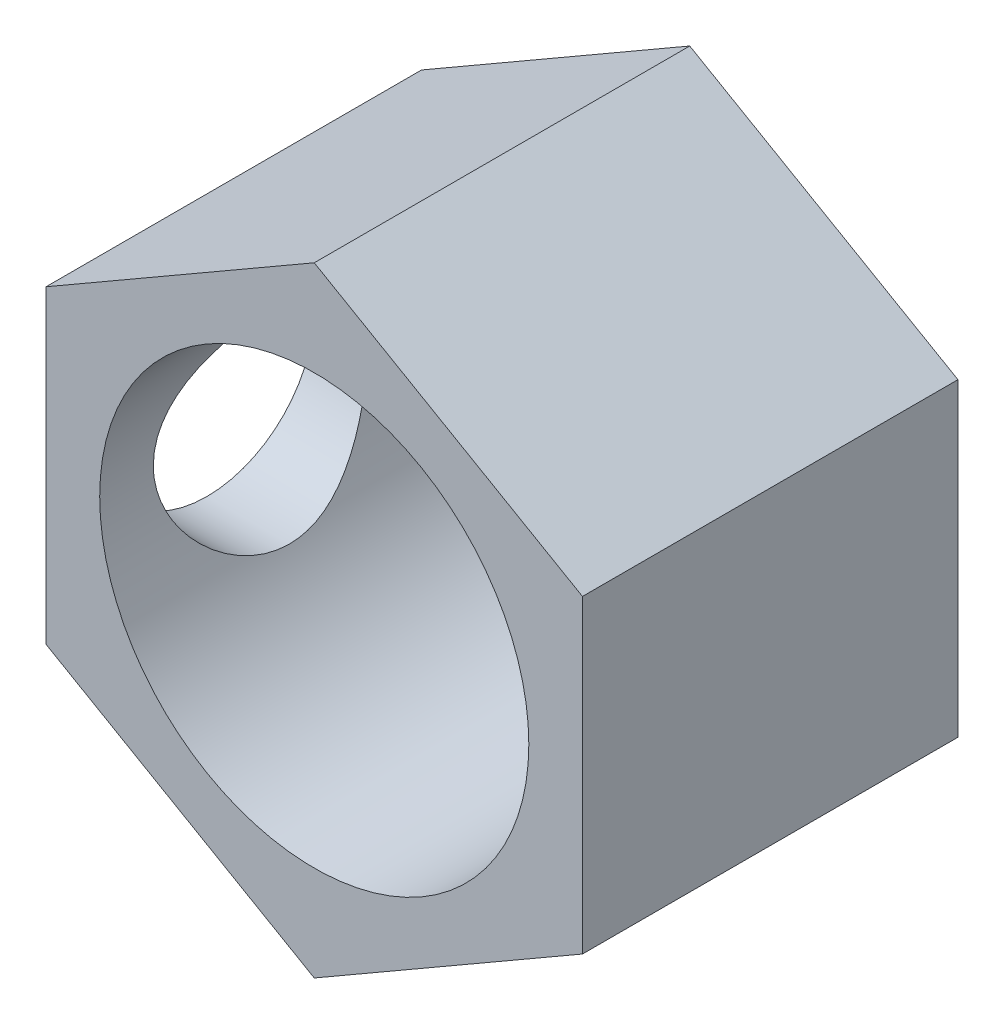
ISO-10303-21;
HEADER;
FILE_DESCRIPTION(('STEP AP214'),'2;1');
FILE_NAME('part.step','',(''),(''),'','','');
FILE_SCHEMA(('AUTOMOTIVE_DESIGN { 1 0 10303 214 1 1 1 1 }'));
ENDSEC;
DATA;
#1=APPLICATION_CONTEXT('core data for automotive mechanical design processes');
#2=APPLICATION_PROTOCOL_DEFINITION('international standard','automotive_design',2000,#1);
#3=PRODUCT_CONTEXT('',#1,'mechanical');
#4=PRODUCT('Part','Part','',(#3));
#5=PRODUCT_RELATED_PRODUCT_CATEGORY('part','',(#4));
#6=PRODUCT_DEFINITION_FORMATION('','',#4);
#7=PRODUCT_DEFINITION_CONTEXT('part definition',#1,'design');
#8=PRODUCT_DEFINITION('design','',#6,#7);
#9=PRODUCT_DEFINITION_SHAPE('','',#8);
#10=(LENGTH_UNIT() NAMED_UNIT(*) SI_UNIT(.MILLI.,.METRE.));
#11=(NAMED_UNIT(*) PLANE_ANGLE_UNIT() SI_UNIT($,.RADIAN.));
#12=(NAMED_UNIT(*) SI_UNIT($,.STERADIAN.) SOLID_ANGLE_UNIT());
#13=UNCERTAINTY_MEASURE_WITH_UNIT(LENGTH_MEASURE(1.E-05),#10,'distance_accuracy_value','');
#14=(GEOMETRIC_REPRESENTATION_CONTEXT(3) GLOBAL_UNCERTAINTY_ASSIGNED_CONTEXT((#13)) GLOBAL_UNIT_ASSIGNED_CONTEXT((#10,
#11,#12)) REPRESENTATION_CONTEXT('',''));
#15=CARTESIAN_POINT('',(0.,0.,0.));
#16=DIRECTION('',(0.,0.,1.));
#17=DIRECTION('',(1.,0.,0.));
#18=AXIS2_PLACEMENT_3D('',#15,#16,#17);
#19=CARTESIAN_POINT('',(-5.00000000000004,-2.88675134594815,6.));
#20=DIRECTION('',(0.5,0.866025403784439,0.));
#21=DIRECTION('',(-0.866025403784439,0.5,0.));
#22=AXIS2_PLACEMENT_3D('',#19,#20,#21);
#23=PLANE('',#22);
#24=DIRECTION('',(0.,0.,-1.));
#25=VECTOR('',#24,1.);
#26=CARTESIAN_POINT('',(-5.00000000000004,-2.88675134594815,6.));
#27=LINE('',#26,#25);
#28=CARTESIAN_POINT('',(-5.00000000000004,-2.88675134594815,6.));
#29=VERTEX_POINT('',#28);
#30=CARTESIAN_POINT('',(-5.00000000000008,-2.88675134594811,-1.));
#31=VERTEX_POINT('',#30);
#32=EDGE_CURVE('E140',#29,#31,#27,.T.);
#33=ORIENTED_EDGE('',*,*,#32,.T.);
#34=DIRECTION('',(-0.866025403784434,0.500000000000008,0.));
#35=VECTOR('',#34,1.);
#36=CARTESIAN_POINT('',(0.,-5.77350269189632,-1.));
#37=LINE('',#36,#35);
#38=CARTESIAN_POINT('',(0.,-5.77350269189632,-1.));
#39=VERTEX_POINT('',#38);
#40=EDGE_CURVE('E124',#39,#31,#37,.T.);
#41=ORIENTED_EDGE('',*,*,#40,.F.);
#42=DIRECTION('',(0.,0.,-1.));
#43=VECTOR('',#42,1.);
#44=CARTESIAN_POINT('',(0.,-5.77350269189631,6.));
#45=LINE('',#44,#43);
#46=CARTESIAN_POINT('',(0.,-5.77350269189631,6.));
#47=VERTEX_POINT('',#46);
#48=EDGE_CURVE('E11',#47,#39,#45,.T.);
#49=ORIENTED_EDGE('',*,*,#48,.F.);
#50=DIRECTION('',(0.866025403784439,-0.5,0.));
#51=VECTOR('',#50,1.);
#52=CARTESIAN_POINT('',(-5.00000000000004,-2.88675134594815,6.));
#53=LINE('',#52,#51);
#54=EDGE_CURVE('E130',#29,#47,#53,.T.);
#55=ORIENTED_EDGE('',*,*,#54,.F.);
#56=EDGE_LOOP('',(#33,#41,#49,#55));
#57=FACE_BOUND('',#56,.T.);
#58=ADVANCED_FACE('F37',(#57),#23,.F.);
#59=CARTESIAN_POINT('',(0.,-5.77350269189631,6.));
#60=DIRECTION('',(-0.5,0.866025403784439,0.));
#61=DIRECTION('',(-0.866025403784439,-0.5,0.));
#62=AXIS2_PLACEMENT_3D('',#59,#60,#61);
#63=PLANE('',#62);
#64=ORIENTED_EDGE('',*,*,#48,.T.);
#65=DIRECTION('',(-0.866025403784442,-0.499999999999994,0.));
#66=VECTOR('',#65,1.);
#67=CARTESIAN_POINT('',(5.00000000000004,-2.88675134594819,-1.));
#68=LINE('',#67,#66);
#69=CARTESIAN_POINT('',(5.00000000000004,-2.88675134594819,-1.));
#70=VERTEX_POINT('',#69);
#71=EDGE_CURVE('E121',#70,#39,#68,.T.);
#72=ORIENTED_EDGE('',*,*,#71,.F.);
#73=DIRECTION('',(0.,0.,-1.));
#74=VECTOR('',#73,1.);
#75=CARTESIAN_POINT('',(5.00000000000004,-2.88675134594816,6.));
#76=LINE('',#75,#74);
#77=CARTESIAN_POINT('',(5.00000000000004,-2.88675134594816,6.));
#78=VERTEX_POINT('',#77);
#79=EDGE_CURVE('E44',#78,#70,#76,.T.);
#80=ORIENTED_EDGE('',*,*,#79,.F.);
#81=DIRECTION('',(0.866025403784439,0.5,0.));
#82=VECTOR('',#81,1.);
#83=CARTESIAN_POINT('',(0.,-5.77350269189631,6.));
#84=LINE('',#83,#82);
#85=EDGE_CURVE('E132',#47,#78,#84,.T.);
#86=ORIENTED_EDGE('',*,*,#85,.F.);
#87=EDGE_LOOP('',(#64,#72,#80,#86));
#88=FACE_BOUND('',#87,.T.);
#89=ADVANCED_FACE('F150',(#88),#63,.F.);
#90=CARTESIAN_POINT('',(5.00000000000004,-2.88675134594816,6.));
#91=DIRECTION('',(-1.,0.,0.));
#92=DIRECTION('',(0.,0.,1.));
#93=AXIS2_PLACEMENT_3D('',#90,#91,#92);
#94=PLANE('',#93);
#95=ORIENTED_EDGE('',*,*,#79,.T.);
#96=DIRECTION('',(0.,-1.,0.));
#97=VECTOR('',#96,1.);
#98=CARTESIAN_POINT('',(5.00000000000006,2.88675134594814,-1.));
#99=LINE('',#98,#97);
#100=CARTESIAN_POINT('',(5.00000000000006,2.88675134594814,-1.));
#101=VERTEX_POINT('',#100);
#102=EDGE_CURVE('E105',#101,#70,#99,.T.);
#103=ORIENTED_EDGE('',*,*,#102,.F.);
#104=DIRECTION('',(0.,0.,-1.));
#105=VECTOR('',#104,1.);
#106=CARTESIAN_POINT('',(5.00000000000004,2.88675134594817,6.));
#107=LINE('',#106,#105);
#108=CARTESIAN_POINT('',(5.00000000000004,2.88675134594817,6.));
#109=VERTEX_POINT('',#108);
#110=EDGE_CURVE('E95',#109,#101,#107,.T.);
#111=ORIENTED_EDGE('',*,*,#110,.F.);
#112=DIRECTION('',(0.,1.,0.));
#113=VECTOR('',#112,1.);
#114=CARTESIAN_POINT('',(5.00000000000004,-2.88675134594816,6.));
#115=LINE('',#114,#113);
#116=EDGE_CURVE('E134',#78,#109,#115,.T.);
#117=ORIENTED_EDGE('',*,*,#116,.F.);
#118=EDGE_LOOP('',(#95,#103,#111,#117));
#119=FACE_BOUND('',#118,.T.);
#120=ADVANCED_FACE('F146',(#119),#94,.F.);
#121=CARTESIAN_POINT('',(5.00000000000004,2.88675134594817,6.));
#122=DIRECTION('',(-0.5,-0.866025403784439,0.));
#123=DIRECTION('',(0.866025403784439,-0.5,0.));
#124=AXIS2_PLACEMENT_3D('',#121,#122,#123);
#125=PLANE('',#124);
#126=ORIENTED_EDGE('',*,*,#110,.T.);
#127=DIRECTION('',(0.866025403784437,-0.500000000000002,0.));
#128=VECTOR('',#127,1.);
#129=CARTESIAN_POINT('',(0.,5.77350269189632,-1.));
#130=LINE('',#129,#128);
#131=CARTESIAN_POINT('',(0.,5.77350269189632,-1.));
#132=VERTEX_POINT('',#131);
#133=EDGE_CURVE('E99',#132,#101,#130,.T.);
#134=ORIENTED_EDGE('',*,*,#133,.F.);
#135=DIRECTION('',(0.,0.,-1.));
#136=VECTOR('',#135,1.);
#137=CARTESIAN_POINT('',(0.,5.77350269189632,6.));
#138=LINE('',#137,#136);
#139=CARTESIAN_POINT('',(0.,5.77350269189632,6.));
#140=VERTEX_POINT('',#139);
#141=EDGE_CURVE('E88',#140,#132,#138,.T.);
#142=ORIENTED_EDGE('',*,*,#141,.F.);
#143=DIRECTION('',(-0.866025403784439,0.5,0.));
#144=VECTOR('',#143,1.);
#145=CARTESIAN_POINT('',(5.00000000000004,2.88675134594817,6.));
#146=LINE('',#145,#144);
#147=EDGE_CURVE('E136',#109,#140,#146,.T.);
#148=ORIENTED_EDGE('',*,*,#147,.F.);
#149=EDGE_LOOP('',(#126,#134,#142,#148));
#150=FACE_BOUND('',#149,.T.);
#151=ADVANCED_FACE('F100',(#150),#125,.F.);
#152=CARTESIAN_POINT('',(0.,5.77350269189632,6.));
#153=DIRECTION('',(0.5,-0.866025403784438,0.));
#154=DIRECTION('',(0.866025403784439,0.5,0.));
#155=AXIS2_PLACEMENT_3D('',#152,#153,#154);
#156=PLANE('',#155);
#157=ORIENTED_EDGE('',*,*,#141,.T.);
#158=DIRECTION('',(0.866025403784442,0.499999999999994,0.));
#159=VECTOR('',#158,1.);
#160=CARTESIAN_POINT('',(-5.00000000000002,2.88675134594822,-1.));
#161=LINE('',#160,#159);
#162=CARTESIAN_POINT('',(-5.00000000000002,2.88675134594822,-1.));
#163=VERTEX_POINT('',#162);
#164=EDGE_CURVE('E92',#163,#132,#161,.T.);
#165=ORIENTED_EDGE('',*,*,#164,.F.);
#166=DIRECTION('',(0.,0.,-1.));
#167=VECTOR('',#166,1.);
#168=CARTESIAN_POINT('',(-5.00000000000005,2.88675134594816,6.));
#169=LINE('',#168,#167);
#170=CARTESIAN_POINT('',(-5.00000000000005,2.88675134594816,6.));
#171=VERTEX_POINT('',#170);
#172=EDGE_CURVE('E96',#171,#163,#169,.T.);
#173=ORIENTED_EDGE('',*,*,#172,.F.);
#174=DIRECTION('',(-0.866025403784439,-0.5,0.));
#175=VECTOR('',#174,1.);
#176=CARTESIAN_POINT('',(0.,5.77350269189632,6.));
#177=LINE('',#176,#175);
#178=EDGE_CURVE('E56',#140,#171,#177,.T.);
#179=ORIENTED_EDGE('',*,*,#178,.F.);
#180=EDGE_LOOP('',(#157,#165,#173,#179));
#181=FACE_BOUND('',#180,.T.);
#182=ADVANCED_FACE('F90',(#181),#156,.F.);
#183=CARTESIAN_POINT('',(-5.00000000000005,2.88675134594816,6.));
#184=DIRECTION('',(1.,0.,0.));
#185=DIRECTION('',(0.,1.,0.));
#186=AXIS2_PLACEMENT_3D('',#183,#184,#185);
#187=PLANE('',#186);
#188=CARTESIAN_POINT('',(-5.00000000000005,0.,3.));
#189=DIRECTION('',(-1.,0.,0.));
#190=DIRECTION('',(0.,-1.,0.));
#191=AXIS2_PLACEMENT_3D('',#188,#189,#190);
#192=CIRCLE('',#191,2.);
#193=CARTESIAN_POINT('',(-5.00000000000004,-2.,3.));
#194=VERTEX_POINT('',#193);
#195=EDGE_CURVE('E127',#194,#194,#192,.T.);
#196=ORIENTED_EDGE('',*,*,#195,.F.);
#197=EDGE_LOOP('',(#196));
#198=FACE_BOUND('',#197,.T.);
#199=ORIENTED_EDGE('',*,*,#172,.T.);
#200=DIRECTION('',(0.,1.,0.));
#201=VECTOR('',#200,1.);
#202=CARTESIAN_POINT('',(-5.00000000000008,-2.88675134594811,-1.));
#203=LINE('',#202,#201);
#204=EDGE_CURVE('E111',#31,#163,#203,.T.);
#205=ORIENTED_EDGE('',*,*,#204,.F.);
#206=ORIENTED_EDGE('',*,*,#32,.F.);
#207=DIRECTION('',(0.,-1.,0.));
#208=VECTOR('',#207,1.);
#209=CARTESIAN_POINT('',(-5.00000000000005,2.88675134594816,6.));
#210=LINE('',#209,#208);
#211=EDGE_CURVE('E51',#171,#29,#210,.T.);
#212=ORIENTED_EDGE('',*,*,#211,.F.);
#213=EDGE_LOOP('',(#199,#205,#206,#212));
#214=FACE_BOUND('',#213,.T.);
#215=ADVANCED_FACE('F155',(#198,#214),#187,.F.);
#216=CARTESIAN_POINT('',(0.,0.,6.));
#217=DIRECTION('',(0.,0.,1.));
#218=DIRECTION('',(1.,0.,0.));
#219=AXIS2_PLACEMENT_3D('',#216,#217,#218);
#220=PLANE('',#219);
#221=CARTESIAN_POINT('',(0.,0.,6.));
#222=DIRECTION('',(0.,0.,1.));
#223=DIRECTION('',(1.,0.,0.));
#224=AXIS2_PLACEMENT_3D('',#221,#222,#223);
#225=CIRCLE('',#224,4.);
#226=CARTESIAN_POINT('',(4.,0.,6.));
#227=VERTEX_POINT('',#226);
#228=EDGE_CURVE('E118',#227,#227,#225,.F.);
#229=ORIENTED_EDGE('',*,*,#228,.T.);
#230=EDGE_LOOP('',(#229));
#231=FACE_BOUND('',#230,.T.);
#232=ORIENTED_EDGE('',*,*,#54,.T.);
#233=ORIENTED_EDGE('',*,*,#85,.T.);
#234=ORIENTED_EDGE('',*,*,#116,.T.);
#235=ORIENTED_EDGE('',*,*,#147,.T.);
#236=ORIENTED_EDGE('',*,*,#178,.T.);
#237=ORIENTED_EDGE('',*,*,#211,.T.);
#238=EDGE_LOOP('',(#232,#233,#234,#235,#236,#237));
#239=FACE_BOUND('',#238,.T.);
#240=ADVANCED_FACE('F157',(#231,#239),#220,.T.);
#241=CARTESIAN_POINT('',(-2.50000000000005,0.,3.));
#242=DIRECTION('',(-1.,0.,0.));
#243=DIRECTION('',(0.,-1.,0.));
#244=AXIS2_PLACEMENT_3D('',#241,#242,#243);
#245=CYLINDRICAL_SURFACE('',#244,2.);
#246=CARTESIAN_POINT('',(-4.,0.,5.));
#247=CARTESIAN_POINT('',(-3.99999426810082,0.105143925902467,4.99999339536562));
#248=CARTESIAN_POINT('',(-3.99580982039513,0.210413199395125,4.99165985375789));
#249=CARTESIAN_POINT('',(-3.97948312074314,0.417840470537792,4.95869423931692));
#250=CARTESIAN_POINT('',(-3.96732575657839,0.519992173427259,4.93403121400437));
#251=CARTESIAN_POINT('',(-3.93632558806751,0.717867089760898,4.86961238276674));
#252=CARTESIAN_POINT('',(-3.91750878355075,0.813613605878293,4.82991523150407));
#253=CARTESIAN_POINT('',(-3.87491553031523,0.996945233613198,4.73685875727003));
#254=CARTESIAN_POINT('',(-3.8511394726705,1.08453098798012,4.68350051150227));
#255=CARTESIAN_POINT('',(-3.79912516516124,1.25501563552382,4.56096550102943));
#256=CARTESIAN_POINT('',(-3.77070398255074,1.33731042224422,4.49102704152073));
#257=CARTESIAN_POINT('',(-3.71319940493486,1.48955888973396,4.33895704150593));
#258=CARTESIAN_POINT('',(-3.68411552418069,1.55950316621354,4.25681629645512));
#259=CARTESIAN_POINT('',(-3.62597902394695,1.69050400090056,4.07503330095324));
#260=CARTESIAN_POINT('',(-3.59710373940264,1.75045067110328,3.97452780330818));
#261=CARTESIAN_POINT('',(-3.54571957544641,1.85233645378139,3.76326532802757));
#262=CARTESIAN_POINT('',(-3.52320615213979,1.89428842993267,3.6525157425545));
#263=CARTESIAN_POINT('',(-3.48915734075617,1.95626488437718,3.43066978915616));
#264=CARTESIAN_POINT('',(-3.47704543167427,1.97745171416089,3.31999109586522));
#265=CARTESIAN_POINT('',(-3.46363779897055,2.00085398661769,3.09604232444105));
#266=CARTESIAN_POINT('',(-3.46233138686576,2.00308817674615,2.98277491825769));
#267=CARTESIAN_POINT('',(-3.47021860514497,1.98937457434459,2.77142795136927));
#268=CARTESIAN_POINT('',(-3.47817527324027,1.97556911907365,2.6731519375539));
#269=CARTESIAN_POINT('',(-3.501524574677,1.93387969811387,2.48055618125392));
#270=CARTESIAN_POINT('',(-3.51691957663552,1.90599124779531,2.38623770938937));
#271=CARTESIAN_POINT('',(-3.55374952825482,1.83641956077201,2.20154173486868));
#272=CARTESIAN_POINT('',(-3.57531681327997,1.79443013423199,2.11130720242843));
#273=CARTESIAN_POINT('',(-3.62206808562807,1.69808337533601,1.93873141481999));
#274=CARTESIAN_POINT('',(-3.64725369560381,1.64372048762494,1.85639372879983));
#275=CARTESIAN_POINT('',(-3.70226315806571,1.51613210982558,1.69095749451355));
#276=CARTESIAN_POINT('',(-3.73227020473492,1.44138891673857,1.60908625284769));
#277=CARTESIAN_POINT('',(-3.79095246600814,1.27911115748275,1.4585291628182));
#278=CARTESIAN_POINT('',(-3.81962703917602,1.19157051314858,1.38984961593224));
#279=CARTESIAN_POINT('',(-3.87403974565928,1.0010330116637,1.26462867794055));
#280=CARTESIAN_POINT('',(-3.89957968324014,0.897507183198825,1.20879905510852));
#281=CARTESIAN_POINT('',(-3.94315762242484,0.680932430977601,1.11580594191398));
#282=CARTESIAN_POINT('',(-3.96120157887106,0.567891152530559,1.07862762996967));
#283=CARTESIAN_POINT('',(-3.98648667482871,0.345532983321412,1.02704919256665));
#284=CARTESIAN_POINT('',(-3.9944987660262,0.23668306109666,1.01101752850644));
#285=CARTESIAN_POINT('',(-4.00146026918207,0.0175591998987102,0.997070537731025));
#286=CARTESIAN_POINT('',(-4.00041397442637,-0.0927140397398108,0.999146628721063));
#287=CARTESIAN_POINT('',(-3.9898238450687,-0.302465943971968,1.02041337683749));
#288=CARTESIAN_POINT('',(-3.98094491376337,-0.402118816099854,1.03826506545999));
#289=CARTESIAN_POINT('',(-3.95644342629681,-0.596813784603876,1.08847614379024));
#290=CARTESIAN_POINT('',(-3.94082012668824,-0.691855371382168,1.12083713290699));
#291=CARTESIAN_POINT('',(-3.90368502827176,-0.87777721689914,1.19999693286606));
#292=CARTESIAN_POINT('',(-3.88201763539262,-0.968460794011601,1.24718210023257));
#293=CARTESIAN_POINT('',(-3.83487948634835,-1.14092272339854,1.35421507129313));
#294=CARTESIAN_POINT('',(-3.80940711133877,-1.22269725955318,1.41406826919079));
#295=CARTESIAN_POINT('',(-3.75416442672396,-1.38353537857842,1.55152085066143));
#296=CARTESIAN_POINT('',(-3.72421769686999,-1.46154415563805,1.63028573689029));
#297=CARTESIAN_POINT('',(-3.6652478321764,-1.60371264223771,1.79985030255545));
#298=CARTESIAN_POINT('',(-3.63622534800094,-1.66786277142374,1.89065823769584));
#299=CARTESIAN_POINT('',(-3.58102384412979,-1.78341582895803,2.08728730834595));
#300=CARTESIAN_POINT('',(-3.55505059178122,-1.83405099160049,2.19362253218896));
#301=CARTESIAN_POINT('',(-3.5114814458827,-1.9161656518694,2.41502013514993));
#302=CARTESIAN_POINT('',(-3.493874764435,-1.94766983173403,2.53007105293378));
#303=CARTESIAN_POINT('',(-3.47123002051604,-1.98772337493374,2.7538204457694));
#304=CARTESIAN_POINT('',(-3.4651476693013,-1.9981859928109,2.86206850687048));
#305=CARTESIAN_POINT('',(-3.46330709283207,-2.0013783087524,3.07889413432905));
#306=CARTESIAN_POINT('',(-3.4675443925278,-1.99411569324648,3.18747153747572));
#307=CARTESIAN_POINT('',(-3.48475724102153,-1.96385225118662,3.39096700306687));
#308=CARTESIAN_POINT('',(-3.49686188965317,-1.94241662868606,3.48620094028948));
#309=CARTESIAN_POINT('',(-3.52742032375305,-1.88635071644882,3.67161623884873));
#310=CARTESIAN_POINT('',(-3.54587615139337,-1.85171618231984,3.76179596418406));
#311=CARTESIAN_POINT('',(-3.58857060729071,-1.76763149060113,3.94124970197307));
#312=CARTESIAN_POINT('',(-3.61311444791841,-1.7173422756314,4.03005580365805));
#313=CARTESIAN_POINT('',(-3.66470663269721,-1.60430194327478,4.19854907236252));
#314=CARTESIAN_POINT('',(-3.69175627591221,-1.54154434248312,4.27823146104222));
#315=CARTESIAN_POINT('',(-3.74924646316184,-1.39640665332275,4.43628396470935));
#316=CARTESIAN_POINT('',(-3.77969966613256,-1.31256884599452,4.51331820470058));
#317=CARTESIAN_POINT('',(-3.83755504519861,-1.13230961246639,4.65252596687054));
#318=CARTESIAN_POINT('',(-3.8649555725239,-1.03588144661039,4.71469147893981));
#319=CARTESIAN_POINT('',(-3.91396019133075,-0.831863193565891,4.82247272542414));
#320=CARTESIAN_POINT('',(-3.93552192987866,-0.724199007553462,4.86796833847294));
#321=CARTESIAN_POINT('',(-3.97002682597974,-0.501484202276174,4.93961633551482));
#322=CARTESIAN_POINT('',(-3.98299446726136,-0.386455599178201,4.96582369361143));
#323=CARTESIAN_POINT('',(-3.99390923826956,-0.225203892981791,4.98779482217148));
#324=CARTESIAN_POINT('',(-3.99618730680502,-0.18032375888313,4.99236528173268));
#325=CARTESIAN_POINT('',(-3.99923393953631,-0.0903034636101833,4.99846933102817));
#326=CARTESIAN_POINT('',(-4.00000246206762,-0.045163295293257,5.00000283694042));
#327=CARTESIAN_POINT('',(-4.,0.,5.));
#328=B_SPLINE_CURVE_WITH_KNOTS('',3,(#246,#247,#248,#249,#250,#251,#252,#253,#254,#255,#256,
#257,#258,#259,#260,#261,#262,#263,#264,#265,#266,#267,#268,#269,#270,#271,#272,#273,#274,#275,
#276,#277,#278,#279,#280,#281,#282,#283,#284,#285,#286,#287,#288,#289,#290,#291,#292,#293,#294,
#295,#296,#297,#298,#299,#300,#301,#302,#303,#304,#305,#306,#307,#308,#309,#310,#311,#312,#313,
#314,#315,#316,#317,#318,#319,#320,#321,#322,#323,#324,#325,#326,#327),.UNSPECIFIED.,.T.,.F.,(4,
2,2,2,2,2,2,2,2,2,2,2,2,2,2,2,2,2,2,2,2,2,2,2,2,2,2,2,2,2,2,2,2,2,2,2,2,2,2,2,4),(0.,
0.315248514840585,0.631096299418395,0.945724310984597,1.26032752116314,1.59396351743618,
1.92785247530807,2.28763452861505,2.64715895796562,2.98516024280459,3.32282714658041,
3.62011424818641,3.91749607851357,4.22180480336975,4.52625042520444,4.86929882667757,
5.21251069197373,5.57166044428881,5.93052433824559,6.25966580942691,6.58865129022952,
6.89213813012244,7.19565843261863,7.50785712055797,7.82018901496679,8.16319221288838,
8.50643177230864,8.86629364323452,9.22569023890901,9.55058615006093,9.87534119729357,
10.1691586049771,10.463070575767,10.7767291356057,11.0905512228726,11.4425048551434,
11.7946476676249,12.1492802732705,12.502898172423,12.6383056026783,12.7737167702213),.UNSPECIFIED.);
#329=CARTESIAN_POINT('',(-4.,0.,5.));
#330=VERTEX_POINT('',#329);
#331=EDGE_CURVE('E112',#330,#330,#328,.T.);
#332=ORIENTED_EDGE('',*,*,#331,.F.);
#333=EDGE_LOOP('',(#332));
#334=FACE_BOUND('',#333,.T.);
#335=ORIENTED_EDGE('',*,*,#195,.T.);
#336=EDGE_LOOP('',(#335));
#337=FACE_BOUND('',#336,.T.);
#338=ADVANCED_FACE('F165',(#334,#337),#245,.F.);
#339=CARTESIAN_POINT('',(0.,0.,-1.));
#340=DIRECTION('',(0.,0.,-1.));
#341=DIRECTION('',(-1.,0.,0.));
#342=AXIS2_PLACEMENT_3D('',#339,#340,#341);
#343=PLANE('',#342);
#344=CARTESIAN_POINT('',(0.,0.,-1.));
#345=DIRECTION('',(0.,0.,-1.));
#346=DIRECTION('',(-1.,0.,0.));
#347=AXIS2_PLACEMENT_3D('',#344,#345,#346);
#348=CIRCLE('',#347,4.);
#349=CARTESIAN_POINT('',(-4.,0.,-1.));
#350=VERTEX_POINT('',#349);
#351=EDGE_CURVE('E115',#350,#350,#348,.T.);
#352=ORIENTED_EDGE('',*,*,#351,.F.);
#353=EDGE_LOOP('',(#352));
#354=FACE_BOUND('',#353,.T.);
#355=ORIENTED_EDGE('',*,*,#164,.T.);
#356=ORIENTED_EDGE('',*,*,#133,.T.);
#357=ORIENTED_EDGE('',*,*,#102,.T.);
#358=ORIENTED_EDGE('',*,*,#71,.T.);
#359=ORIENTED_EDGE('',*,*,#40,.T.);
#360=ORIENTED_EDGE('',*,*,#204,.T.);
#361=EDGE_LOOP('',(#355,#356,#357,#358,#359,#360));
#362=FACE_BOUND('',#361,.T.);
#363=ADVANCED_FACE('F108',(#354,#362),#343,.T.);
#364=CARTESIAN_POINT('',(0.,0.,6.001));
#365=DIRECTION('',(0.,0.,-1.));
#366=DIRECTION('',(-1.,0.,0.));
#367=AXIS2_PLACEMENT_3D('',#364,#365,#366);
#368=CYLINDRICAL_SURFACE('',#367,4.);
#369=ORIENTED_EDGE('',*,*,#228,.F.);
#370=EDGE_LOOP('',(#369));
#371=FACE_BOUND('',#370,.T.);
#372=ORIENTED_EDGE('',*,*,#351,.T.);
#373=EDGE_LOOP('',(#372));
#374=FACE_BOUND('',#373,.T.);
#375=ORIENTED_EDGE('',*,*,#331,.T.);
#376=EDGE_LOOP('',(#375));
#377=FACE_BOUND('',#376,.T.);
#378=ADVANCED_FACE('F213',(#371,#374,#377),#368,.F.);
#379=CLOSED_SHELL('',(#58,#89,#120,#151,#182,#215,#240,#338,#363,#378));
#380=MANIFOLD_SOLID_BREP('B2',#379);
#381=ADVANCED_BREP_SHAPE_REPRESENTATION('',(#18,#380),#14);
#382=SHAPE_DEFINITION_REPRESENTATION(#9,#381);
ENDSEC;
END-ISO-10303-21;
